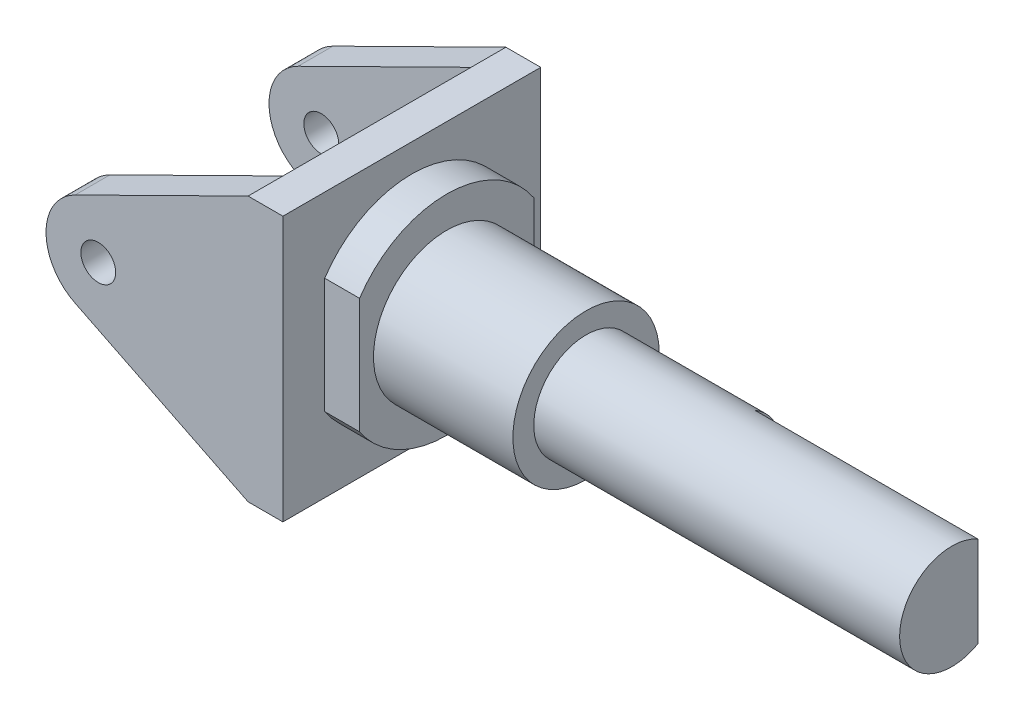
ISO-10303-21;
HEADER;
FILE_DESCRIPTION(('STEP AP214'),'2;1');
FILE_NAME('part.step','',(''),(''),'','','');
FILE_SCHEMA(('AUTOMOTIVE_DESIGN { 1 0 10303 214 1 1 1 1 }'));
ENDSEC;
DATA;
#1=APPLICATION_CONTEXT('core data for automotive mechanical design processes');
#2=APPLICATION_PROTOCOL_DEFINITION('international standard','automotive_design',2000,#1);
#3=PRODUCT_CONTEXT('',#1,'mechanical');
#4=PRODUCT('Part','Part','',(#3));
#5=PRODUCT_RELATED_PRODUCT_CATEGORY('part','',(#4));
#6=PRODUCT_DEFINITION_FORMATION('','',#4);
#7=PRODUCT_DEFINITION_CONTEXT('part definition',#1,'design');
#8=PRODUCT_DEFINITION('design','',#6,#7);
#9=PRODUCT_DEFINITION_SHAPE('','',#8);
#10=(LENGTH_UNIT() NAMED_UNIT(*) SI_UNIT(.MILLI.,.METRE.));
#11=(NAMED_UNIT(*) PLANE_ANGLE_UNIT() SI_UNIT($,.RADIAN.));
#12=(NAMED_UNIT(*) SI_UNIT($,.STERADIAN.) SOLID_ANGLE_UNIT());
#13=UNCERTAINTY_MEASURE_WITH_UNIT(LENGTH_MEASURE(1.E-05),#10,'distance_accuracy_value','');
#14=(GEOMETRIC_REPRESENTATION_CONTEXT(3) GLOBAL_UNCERTAINTY_ASSIGNED_CONTEXT((#13)) GLOBAL_UNIT_ASSIGNED_CONTEXT((#10,
#11,#12)) REPRESENTATION_CONTEXT('',''));
#15=CARTESIAN_POINT('',(0.,0.,0.));
#16=DIRECTION('',(0.,0.,1.));
#17=DIRECTION('',(1.,0.,0.));
#18=AXIS2_PLACEMENT_3D('',#15,#16,#17);
#19=CARTESIAN_POINT('',(77.5,0.,0.));
#20=DIRECTION('',(1.,0.,0.));
#21=DIRECTION('',(0.,0.,-1.));
#22=AXIS2_PLACEMENT_3D('',#19,#20,#21);
#23=CYLINDRICAL_SURFACE('',#22,30.);
#24=DIRECTION('',(1.,0.,0.));
#25=VECTOR('',#24,1.);
#26=CARTESIAN_POINT('',(-77.5,-16.583123951777,-25.));
#27=LINE('',#26,#25);
#28=CARTESIAN_POINT('',(-77.5,-16.583123951777,-25.));
#29=VERTEX_POINT('',#28);
#30=CARTESIAN_POINT('',(-67.5,-16.583123951777,-25.));
#31=VERTEX_POINT('',#30);
#32=EDGE_CURVE('E193',#29,#31,#27,.T.);
#33=ORIENTED_EDGE('',*,*,#32,.T.);
#34=CARTESIAN_POINT('',(-67.5,0.,0.));
#35=DIRECTION('',(1.,0.,0.));
#36=DIRECTION('',(0.,0.,-1.));
#37=AXIS2_PLACEMENT_3D('',#34,#35,#36);
#38=CIRCLE('',#37,30.);
#39=CARTESIAN_POINT('',(-67.5,-16.583123951777,25.));
#40=VERTEX_POINT('',#39);
#41=EDGE_CURVE('E55',#40,#31,#38,.T.);
#42=ORIENTED_EDGE('',*,*,#41,.F.);
#43=DIRECTION('',(1.,0.,0.));
#44=VECTOR('',#43,1.);
#45=CARTESIAN_POINT('',(-77.5,-16.583123951777,25.));
#46=LINE('',#45,#44);
#47=CARTESIAN_POINT('',(-77.5,-16.583123951777,25.));
#48=VERTEX_POINT('',#47);
#49=EDGE_CURVE('E200',#48,#40,#46,.T.);
#50=ORIENTED_EDGE('',*,*,#49,.F.);
#51=CARTESIAN_POINT('',(-77.5,0.,0.));
#52=DIRECTION('',(1.,0.,0.));
#53=DIRECTION('',(0.,0.,-1.));
#54=AXIS2_PLACEMENT_3D('',#51,#52,#53);
#55=CIRCLE('',#54,30.);
#56=EDGE_CURVE('E332',#48,#29,#55,.T.);
#57=ORIENTED_EDGE('',*,*,#56,.T.);
#58=EDGE_LOOP('',(#33,#42,#50,#57));
#59=FACE_BOUND('',#58,.T.);
#60=ADVANCED_FACE('F45',(#59),#23,.T.);
#61=CARTESIAN_POINT('',(-87.5,0.,0.));
#62=DIRECTION('',(-1.,0.,0.));
#63=DIRECTION('',(0.,0.,1.));
#64=AXIS2_PLACEMENT_3D('',#61,#62,#63);
#65=PLANE('',#64);
#66=DIRECTION('',(0.,0.,1.));
#67=VECTOR('',#66,1.);
#68=CARTESIAN_POINT('',(-87.5,-38.,-37.));
#69=LINE('',#68,#67);
#70=CARTESIAN_POINT('',(-87.5,-38.,-27.));
#71=VERTEX_POINT('',#70);
#72=CARTESIAN_POINT('',(-87.5,-38.,27.));
#73=VERTEX_POINT('',#72);
#74=EDGE_CURVE('E298',#71,#73,#69,.T.);
#75=ORIENTED_EDGE('',*,*,#74,.T.);
#76=DIRECTION('',(0.,1.,0.));
#77=VECTOR('',#76,1.);
#78=CARTESIAN_POINT('',(-87.5,0.,27.));
#79=LINE('',#78,#77);
#80=CARTESIAN_POINT('',(-87.5,38.,27.));
#81=VERTEX_POINT('',#80);
#82=EDGE_CURVE('E254',#73,#81,#79,.T.);
#83=ORIENTED_EDGE('',*,*,#82,.T.);
#84=DIRECTION('',(0.,0.,-1.));
#85=VECTOR('',#84,1.);
#86=CARTESIAN_POINT('',(-87.5,38.,-37.));
#87=LINE('',#86,#85);
#88=CARTESIAN_POINT('',(-87.5,38.,-27.));
#89=VERTEX_POINT('',#88);
#90=EDGE_CURVE('E299',#81,#89,#87,.T.);
#91=ORIENTED_EDGE('',*,*,#90,.T.);
#92=DIRECTION('',(0.,-1.,0.));
#93=VECTOR('',#92,1.);
#94=CARTESIAN_POINT('',(-87.5,0.,-27.));
#95=LINE('',#94,#93);
#96=EDGE_CURVE('E290',#89,#71,#95,.T.);
#97=ORIENTED_EDGE('',*,*,#96,.T.);
#98=EDGE_LOOP('',(#75,#83,#91,#97));
#99=FACE_BOUND('',#98,.T.);
#100=ADVANCED_FACE('F386',(#99),#65,.T.);
#101=DIRECTION('',(1.,0.,0.));
#102=VECTOR('',#101,1.);
#103=CARTESIAN_POINT('',(-77.5,16.583123951777,-25.));
#104=LINE('',#103,#102);
#105=CARTESIAN_POINT('',(-77.5,16.583123951777,-25.));
#106=VERTEX_POINT('',#105);
#107=CARTESIAN_POINT('',(-67.5,16.583123951777,-25.));
#108=VERTEX_POINT('',#107);
#109=EDGE_CURVE('E188',#106,#108,#104,.T.);
#110=ORIENTED_EDGE('',*,*,#109,.F.);
#111=CARTESIAN_POINT('',(-77.5,16.583123951777,25.));
#112=VERTEX_POINT('',#111);
#113=EDGE_CURVE('E333',#106,#112,#55,.T.);
#114=ORIENTED_EDGE('',*,*,#113,.T.);
#115=DIRECTION('',(1.,0.,0.));
#116=VECTOR('',#115,1.);
#117=CARTESIAN_POINT('',(-77.5,16.583123951777,25.));
#118=LINE('',#117,#116);
#119=CARTESIAN_POINT('',(-67.5,16.583123951777,25.));
#120=VERTEX_POINT('',#119);
#121=EDGE_CURVE('E182',#112,#120,#118,.T.);
#122=ORIENTED_EDGE('',*,*,#121,.T.);
#123=EDGE_CURVE('E11',#108,#120,#38,.T.);
#124=ORIENTED_EDGE('',*,*,#123,.F.);
#125=EDGE_LOOP('',(#110,#114,#122,#124));
#126=FACE_BOUND('',#125,.T.);
#127=ADVANCED_FACE('F47',(#126),#23,.T.);
#128=CARTESIAN_POINT('',(-67.5,30.,0.));
#129=DIRECTION('',(1.,0.,0.));
#130=DIRECTION('',(0.,0.,-1.));
#131=AXIS2_PLACEMENT_3D('',#128,#129,#130);
#132=PLANE('',#131);
#133=DIRECTION('',(0.,-1.,0.));
#134=VECTOR('',#133,1.);
#135=CARTESIAN_POINT('',(-67.5,16.583123951777,-25.));
#136=LINE('',#135,#134);
#137=EDGE_CURVE('E189',#108,#31,#136,.T.);
#138=ORIENTED_EDGE('',*,*,#137,.F.);
#139=ORIENTED_EDGE('',*,*,#123,.T.);
#140=DIRECTION('',(0.,1.,0.));
#141=VECTOR('',#140,1.);
#142=CARTESIAN_POINT('',(-67.5,16.583123951777,25.));
#143=LINE('',#142,#141);
#144=EDGE_CURVE('E192',#40,#120,#143,.T.);
#145=ORIENTED_EDGE('',*,*,#144,.F.);
#146=ORIENTED_EDGE('',*,*,#41,.T.);
#147=EDGE_LOOP('',(#138,#139,#145,#146));
#148=FACE_BOUND('',#147,.T.);
#149=CARTESIAN_POINT('',(-67.5,0.,0.));
#150=DIRECTION('',(1.,0.,0.));
#151=DIRECTION('',(0.,0.,-1.));
#152=AXIS2_PLACEMENT_3D('',#149,#150,#151);
#153=CIRCLE('',#152,21.);
#154=CARTESIAN_POINT('',(-67.5,0.,-21.));
#155=VERTEX_POINT('',#154);
#156=EDGE_CURVE('E347',#155,#155,#153,.T.);
#157=ORIENTED_EDGE('',*,*,#156,.F.);
#158=EDGE_LOOP('',(#157));
#159=FACE_BOUND('',#158,.T.);
#160=ADVANCED_FACE('F358',(#148,#159),#132,.T.);
#161=CARTESIAN_POINT('',(77.5,0.,0.));
#162=DIRECTION('',(1.,0.,0.));
#163=DIRECTION('',(0.,0.,-1.));
#164=AXIS2_PLACEMENT_3D('',#161,#162,#163);
#165=CYLINDRICAL_SURFACE('',#164,21.);
#166=ORIENTED_EDGE('',*,*,#156,.T.);
#167=EDGE_LOOP('',(#166));
#168=FACE_BOUND('',#167,.T.);
#169=CARTESIAN_POINT('',(-27.5,0.,0.));
#170=DIRECTION('',(1.,0.,0.));
#171=DIRECTION('',(0.,0.,-1.));
#172=AXIS2_PLACEMENT_3D('',#169,#170,#171);
#173=CIRCLE('',#172,21.);
#174=CARTESIAN_POINT('',(-27.5,0.,-21.));
#175=VERTEX_POINT('',#174);
#176=EDGE_CURVE('E343',#175,#175,#173,.T.);
#177=ORIENTED_EDGE('',*,*,#176,.F.);
#178=EDGE_LOOP('',(#177));
#179=FACE_BOUND('',#178,.T.);
#180=ADVANCED_FACE('F396',(#168,#179),#165,.T.);
#181=CARTESIAN_POINT('',(-27.5,21.,0.));
#182=DIRECTION('',(1.,0.,0.));
#183=DIRECTION('',(0.,0.,-1.));
#184=AXIS2_PLACEMENT_3D('',#181,#182,#183);
#185=PLANE('',#184);
#186=ORIENTED_EDGE('',*,*,#176,.T.);
#187=EDGE_LOOP('',(#186));
#188=FACE_BOUND('',#187,.T.);
#189=CARTESIAN_POINT('',(-27.5,0.,0.));
#190=DIRECTION('',(1.,0.,0.));
#191=DIRECTION('',(0.,0.,-1.));
#192=AXIS2_PLACEMENT_3D('',#189,#190,#191);
#193=CIRCLE('',#192,15.);
#194=CARTESIAN_POINT('',(-27.5,0.,-15.));
#195=VERTEX_POINT('',#194);
#196=EDGE_CURVE('E339',#195,#195,#193,.T.);
#197=ORIENTED_EDGE('',*,*,#196,.F.);
#198=EDGE_LOOP('',(#197));
#199=FACE_BOUND('',#198,.T.);
#200=ADVANCED_FACE('F400',(#188,#199),#185,.T.);
#201=CARTESIAN_POINT('',(77.5,0.,0.));
#202=DIRECTION('',(1.,0.,0.));
#203=DIRECTION('',(0.,0.,-1.));
#204=AXIS2_PLACEMENT_3D('',#201,#202,#203);
#205=CYLINDRICAL_SURFACE('',#204,15.);
#206=DIRECTION('',(1.,0.,0.));
#207=VECTOR('',#206,1.);
#208=CARTESIAN_POINT('',(13.5,-12.9903810567666,-7.5));
#209=LINE('',#208,#207);
#210=CARTESIAN_POINT('',(13.5,-12.9903810567666,-7.5));
#211=VERTEX_POINT('',#210);
#212=CARTESIAN_POINT('',(77.5,-12.9903810567666,-7.5));
#213=VERTEX_POINT('',#212);
#214=EDGE_CURVE('E171',#211,#213,#209,.T.);
#215=ORIENTED_EDGE('',*,*,#214,.T.);
#216=CARTESIAN_POINT('',(77.5,0.,0.));
#217=DIRECTION('',(1.,0.,0.));
#218=DIRECTION('',(0.,0.,-1.));
#219=AXIS2_PLACEMENT_3D('',#216,#217,#218);
#220=CIRCLE('',#219,15.);
#221=CARTESIAN_POINT('',(77.5,12.9903810567666,-7.5));
#222=VERTEX_POINT('',#221);
#223=EDGE_CURVE('E178',#222,#213,#220,.T.);
#224=ORIENTED_EDGE('',*,*,#223,.F.);
#225=DIRECTION('',(1.,0.,0.));
#226=VECTOR('',#225,1.);
#227=CARTESIAN_POINT('',(13.5,12.9903810567666,-7.5));
#228=LINE('',#227,#226);
#229=CARTESIAN_POINT('',(13.5,12.9903810567666,-7.5));
#230=VERTEX_POINT('',#229);
#231=EDGE_CURVE('E62',#230,#222,#228,.T.);
#232=ORIENTED_EDGE('',*,*,#231,.F.);
#233=CARTESIAN_POINT('',(13.5,0.,0.));
#234=DIRECTION('',(1.,0.,0.));
#235=DIRECTION('',(0.,0.,-1.));
#236=AXIS2_PLACEMENT_3D('',#233,#234,#235);
#237=CIRCLE('',#236,15.);
#238=EDGE_CURVE('E162',#211,#230,#237,.T.);
#239=ORIENTED_EDGE('',*,*,#238,.F.);
#240=EDGE_LOOP('',(#215,#224,#232,#239));
#241=FACE_BOUND('',#240,.T.);
#242=ORIENTED_EDGE('',*,*,#196,.T.);
#243=EDGE_LOOP('',(#242));
#244=FACE_BOUND('',#243,.T.);
#245=ADVANCED_FACE('F175',(#241,#244),#205,.T.);
#246=CARTESIAN_POINT('',(77.5,15.,0.));
#247=DIRECTION('',(1.,0.,0.));
#248=DIRECTION('',(0.,0.,-1.));
#249=AXIS2_PLACEMENT_3D('',#246,#247,#248);
#250=PLANE('',#249);
#251=DIRECTION('',(0.,-1.,0.));
#252=VECTOR('',#251,1.);
#253=CARTESIAN_POINT('',(77.5,12.9903810567666,-7.5));
#254=LINE('',#253,#252);
#255=EDGE_CURVE('E168',#222,#213,#254,.T.);
#256=ORIENTED_EDGE('',*,*,#255,.F.);
#257=ORIENTED_EDGE('',*,*,#223,.T.);
#258=EDGE_LOOP('',(#256,#257));
#259=FACE_BOUND('',#258,.T.);
#260=ADVANCED_FACE('F408',(#259),#250,.T.);
#261=CARTESIAN_POINT('',(-87.5,38.,37.));
#262=DIRECTION('',(0.,0.,-1.));
#263=DIRECTION('',(0.,1.,0.));
#264=AXIS2_PLACEMENT_3D('',#261,#262,#263);
#265=PLANE('',#264);
#266=CARTESIAN_POINT('',(-130.5,0.,37.));
#267=DIRECTION('',(0.,0.,-1.));
#268=DIRECTION('',(0.,1.,0.));
#269=AXIS2_PLACEMENT_3D('',#266,#267,#268);
#270=CIRCLE('',#269,5.);
#271=CARTESIAN_POINT('',(-130.5,5.00000000000002,37.));
#272=VERTEX_POINT('',#271);
#273=EDGE_CURVE('E214',#272,#272,#270,.T.);
#274=ORIENTED_EDGE('',*,*,#273,.T.);
#275=EDGE_LOOP('',(#274));
#276=FACE_BOUND('',#275,.T.);
#277=DIRECTION('',(0.,1.,0.));
#278=VECTOR('',#277,1.);
#279=CARTESIAN_POINT('',(-77.5,38.,37.));
#280=LINE('',#279,#278);
#281=CARTESIAN_POINT('',(-77.5,-38.,37.));
#282=VERTEX_POINT('',#281);
#283=CARTESIAN_POINT('',(-77.5,38.,37.));
#284=VERTEX_POINT('',#283);
#285=EDGE_CURVE('E293',#282,#284,#280,.T.);
#286=ORIENTED_EDGE('',*,*,#285,.T.);
#287=DIRECTION('',(1.,0.,0.));
#288=VECTOR('',#287,1.);
#289=CARTESIAN_POINT('',(-87.5,38.,37.));
#290=LINE('',#289,#288);
#291=CARTESIAN_POINT('',(-87.5,38.,37.));
#292=VERTEX_POINT('',#291);
#293=EDGE_CURVE('E328',#292,#284,#290,.T.);
#294=ORIENTED_EDGE('',*,*,#293,.F.);
#295=DIRECTION('',(-0.896371022456639,-0.443304624496564,0.));
#296=VECTOR('',#295,1.);
#297=CARTESIAN_POINT('',(-87.5,38.,37.));
#298=LINE('',#297,#296);
#299=CARTESIAN_POINT('',(-137.149569367448,13.4455653368496,37.));
#300=VERTEX_POINT('',#299);
#301=EDGE_CURVE('E227',#292,#300,#298,.T.);
#302=ORIENTED_EDGE('',*,*,#301,.T.);
#303=CARTESIAN_POINT('',(-130.5,0.,37.));
#304=DIRECTION('',(0.,0.,-1.));
#305=DIRECTION('',(0.,1.,0.));
#306=AXIS2_PLACEMENT_3D('',#303,#304,#305);
#307=CIRCLE('',#306,15.);
#308=CARTESIAN_POINT('',(-137.149569367448,-13.4455653368496,37.));
#309=VERTEX_POINT('',#308);
#310=EDGE_CURVE('E237',#309,#300,#307,.T.);
#311=ORIENTED_EDGE('',*,*,#310,.F.);
#312=DIRECTION('',(-0.896371022456639,0.443304624496565,0.));
#313=VECTOR('',#312,1.);
#314=CARTESIAN_POINT('',(-87.5,-38.,37.));
#315=LINE('',#314,#313);
#316=CARTESIAN_POINT('',(-87.5,-38.,37.));
#317=VERTEX_POINT('',#316);
#318=EDGE_CURVE('E222',#317,#309,#315,.T.);
#319=ORIENTED_EDGE('',*,*,#318,.F.);
#320=DIRECTION('',(1.,0.,0.));
#321=VECTOR('',#320,1.);
#322=CARTESIAN_POINT('',(-87.5,-38.,37.));
#323=LINE('',#322,#321);
#324=EDGE_CURVE('E304',#317,#282,#323,.T.);
#325=ORIENTED_EDGE('',*,*,#324,.T.);
#326=EDGE_LOOP('',(#286,#294,#302,#311,#319,#325));
#327=FACE_BOUND('',#326,.T.);
#328=ADVANCED_FACE('F411',(#276,#327),#265,.F.);
#329=CARTESIAN_POINT('',(-87.5,38.,-37.));
#330=DIRECTION('',(0.,-1.,0.));
#331=DIRECTION('',(0.,0.,-1.));
#332=AXIS2_PLACEMENT_3D('',#329,#330,#331);
#333=PLANE('',#332);
#334=DIRECTION('',(0.,0.,-1.));
#335=VECTOR('',#334,1.);
#336=CARTESIAN_POINT('',(-77.5,38.,-37.));
#337=LINE('',#336,#335);
#338=CARTESIAN_POINT('',(-77.5,38.,-37.));
#339=VERTEX_POINT('',#338);
#340=EDGE_CURVE('E308',#284,#339,#337,.T.);
#341=ORIENTED_EDGE('',*,*,#340,.T.);
#342=DIRECTION('',(1.,0.,0.));
#343=VECTOR('',#342,1.);
#344=CARTESIAN_POINT('',(-87.5,38.,-37.));
#345=LINE('',#344,#343);
#346=CARTESIAN_POINT('',(-87.5,38.,-37.));
#347=VERTEX_POINT('',#346);
#348=EDGE_CURVE('E324',#347,#339,#345,.T.);
#349=ORIENTED_EDGE('',*,*,#348,.F.);
#350=DIRECTION('',(0.,0.,-1.));
#351=VECTOR('',#350,1.);
#352=CARTESIAN_POINT('',(-87.5,38.,-27.));
#353=LINE('',#352,#351);
#354=EDGE_CURVE('E286',#89,#347,#353,.T.);
#355=ORIENTED_EDGE('',*,*,#354,.F.);
#356=ORIENTED_EDGE('',*,*,#90,.F.);
#357=EDGE_CURVE('E294',#292,#81,#87,.T.);
#358=ORIENTED_EDGE('',*,*,#357,.F.);
#359=ORIENTED_EDGE('',*,*,#293,.T.);
#360=EDGE_LOOP('',(#341,#349,#355,#356,#358,#359));
#361=FACE_BOUND('',#360,.T.);
#362=ADVANCED_FACE('F415',(#361),#333,.F.);
#363=CARTESIAN_POINT('',(-87.5,38.,-37.));
#364=DIRECTION('',(0.,0.,1.));
#365=DIRECTION('',(0.,-1.,0.));
#366=AXIS2_PLACEMENT_3D('',#363,#364,#365);
#367=PLANE('',#366);
#368=CARTESIAN_POINT('',(-130.5,0.,-37.));
#369=DIRECTION('',(0.,0.,-1.));
#370=DIRECTION('',(0.,1.,0.));
#371=AXIS2_PLACEMENT_3D('',#368,#369,#370);
#372=CIRCLE('',#371,5.);
#373=CARTESIAN_POINT('',(-130.5,4.99999999999999,-37.));
#374=VERTEX_POINT('',#373);
#375=EDGE_CURVE('E197',#374,#374,#372,.T.);
#376=ORIENTED_EDGE('',*,*,#375,.F.);
#377=EDGE_LOOP('',(#376));
#378=FACE_BOUND('',#377,.T.);
#379=DIRECTION('',(0.,-1.,0.));
#380=VECTOR('',#379,1.);
#381=CARTESIAN_POINT('',(-77.5,38.,-37.));
#382=LINE('',#381,#380);
#383=CARTESIAN_POINT('',(-77.5,-38.,-37.));
#384=VERTEX_POINT('',#383);
#385=EDGE_CURVE('E311',#339,#384,#382,.T.);
#386=ORIENTED_EDGE('',*,*,#385,.T.);
#387=DIRECTION('',(1.,0.,0.));
#388=VECTOR('',#387,1.);
#389=CARTESIAN_POINT('',(-87.5,-38.,-37.));
#390=LINE('',#389,#388);
#391=CARTESIAN_POINT('',(-87.5,-38.,-37.));
#392=VERTEX_POINT('',#391);
#393=EDGE_CURVE('E320',#392,#384,#390,.T.);
#394=ORIENTED_EDGE('',*,*,#393,.F.);
#395=DIRECTION('',(-0.896371022456639,0.443304624496565,0.));
#396=VECTOR('',#395,1.);
#397=CARTESIAN_POINT('',(-87.5,-38.,-37.));
#398=LINE('',#397,#396);
#399=CARTESIAN_POINT('',(-137.149569367448,-13.4455653368496,-37.));
#400=VERTEX_POINT('',#399);
#401=EDGE_CURVE('E262',#392,#400,#398,.T.);
#402=ORIENTED_EDGE('',*,*,#401,.T.);
#403=CARTESIAN_POINT('',(-130.5,0.,-37.));
#404=DIRECTION('',(0.,0.,-1.));
#405=DIRECTION('',(0.,1.,0.));
#406=AXIS2_PLACEMENT_3D('',#403,#404,#405);
#407=CIRCLE('',#406,15.);
#408=CARTESIAN_POINT('',(-137.149569367448,13.4455653368496,-37.));
#409=VERTEX_POINT('',#408);
#410=EDGE_CURVE('E274',#400,#409,#407,.T.);
#411=ORIENTED_EDGE('',*,*,#410,.T.);
#412=DIRECTION('',(-0.896371022456639,-0.443304624496564,0.));
#413=VECTOR('',#412,1.);
#414=CARTESIAN_POINT('',(-87.5,38.,-37.));
#415=LINE('',#414,#413);
#416=EDGE_CURVE('E257',#347,#409,#415,.T.);
#417=ORIENTED_EDGE('',*,*,#416,.F.);
#418=ORIENTED_EDGE('',*,*,#348,.T.);
#419=EDGE_LOOP('',(#386,#394,#402,#411,#417,#418));
#420=FACE_BOUND('',#419,.T.);
#421=ADVANCED_FACE('F419',(#378,#420),#367,.F.);
#422=CARTESIAN_POINT('',(-87.5,-38.,-37.));
#423=DIRECTION('',(0.,1.,0.));
#424=DIRECTION('',(0.,0.,1.));
#425=AXIS2_PLACEMENT_3D('',#422,#423,#424);
#426=PLANE('',#425);
#427=DIRECTION('',(0.,0.,1.));
#428=VECTOR('',#427,1.);
#429=CARTESIAN_POINT('',(-87.5,-38.,27.));
#430=LINE('',#429,#428);
#431=EDGE_CURVE('E250',#73,#317,#430,.T.);
#432=ORIENTED_EDGE('',*,*,#431,.F.);
#433=ORIENTED_EDGE('',*,*,#74,.F.);
#434=EDGE_CURVE('E300',#392,#71,#69,.T.);
#435=ORIENTED_EDGE('',*,*,#434,.F.);
#436=ORIENTED_EDGE('',*,*,#393,.T.);
#437=DIRECTION('',(0.,0.,1.));
#438=VECTOR('',#437,1.);
#439=CARTESIAN_POINT('',(-77.5,-38.,-37.));
#440=LINE('',#439,#438);
#441=EDGE_CURVE('E314',#384,#282,#440,.T.);
#442=ORIENTED_EDGE('',*,*,#441,.T.);
#443=ORIENTED_EDGE('',*,*,#324,.F.);
#444=EDGE_LOOP('',(#432,#433,#435,#436,#442,#443));
#445=FACE_BOUND('',#444,.T.);
#446=ADVANCED_FACE('F423',(#445),#426,.F.);
#447=CARTESIAN_POINT('',(-77.5,0.,0.));
#448=DIRECTION('',(-1.,0.,0.));
#449=DIRECTION('',(0.,0.,1.));
#450=AXIS2_PLACEMENT_3D('',#447,#448,#449);
#451=PLANE('',#450);
#452=ORIENTED_EDGE('',*,*,#113,.F.);
#453=DIRECTION('',(0.,-1.,0.));
#454=VECTOR('',#453,1.);
#455=CARTESIAN_POINT('',(-77.5,16.583123951777,-25.));
#456=LINE('',#455,#454);
#457=EDGE_CURVE('E70',#106,#29,#456,.T.);
#458=ORIENTED_EDGE('',*,*,#457,.T.);
#459=ORIENTED_EDGE('',*,*,#56,.F.);
#460=DIRECTION('',(0.,1.,0.));
#461=VECTOR('',#460,1.);
#462=CARTESIAN_POINT('',(-77.5,16.583123951777,25.));
#463=LINE('',#462,#461);
#464=EDGE_CURVE('E203',#48,#112,#463,.T.);
#465=ORIENTED_EDGE('',*,*,#464,.T.);
#466=EDGE_LOOP('',(#452,#458,#459,#465));
#467=FACE_BOUND('',#466,.T.);
#468=ORIENTED_EDGE('',*,*,#285,.F.);
#469=ORIENTED_EDGE('',*,*,#441,.F.);
#470=ORIENTED_EDGE('',*,*,#385,.F.);
#471=ORIENTED_EDGE('',*,*,#340,.F.);
#472=EDGE_LOOP('',(#468,#469,#470,#471));
#473=FACE_BOUND('',#472,.T.);
#474=ADVANCED_FACE('F368',(#467,#473),#451,.F.);
#475=CARTESIAN_POINT('',(-87.5,38.,-27.));
#476=DIRECTION('',(0.443304624496564,-0.896371022456639,0.));
#477=DIRECTION('',(0.896371022456639,0.443304624496564,0.));
#478=AXIS2_PLACEMENT_3D('',#475,#476,#477);
#479=PLANE('',#478);
#480=ORIENTED_EDGE('',*,*,#416,.T.);
#481=DIRECTION('',(0.,0.,-1.));
#482=VECTOR('',#481,1.);
#483=CARTESIAN_POINT('',(-137.149569367448,13.4455653368496,-27.));
#484=LINE('',#483,#482);
#485=CARTESIAN_POINT('',(-137.149569367448,13.4455653368496,-27.));
#486=VERTEX_POINT('',#485);
#487=EDGE_CURVE('E283',#486,#409,#484,.T.);
#488=ORIENTED_EDGE('',*,*,#487,.F.);
#489=DIRECTION('',(-0.896371022456639,-0.443304624496564,0.));
#490=VECTOR('',#489,1.);
#491=CARTESIAN_POINT('',(-87.5,38.,-27.));
#492=LINE('',#491,#490);
#493=EDGE_CURVE('E258',#89,#486,#492,.T.);
#494=ORIENTED_EDGE('',*,*,#493,.F.);
#495=ORIENTED_EDGE('',*,*,#354,.T.);
#496=EDGE_LOOP('',(#480,#488,#494,#495));
#497=FACE_BOUND('',#496,.T.);
#498=ADVANCED_FACE('F428',(#497),#479,.F.);
#499=CARTESIAN_POINT('',(-130.5,0.,-27.));
#500=DIRECTION('',(0.,0.,-1.));
#501=DIRECTION('',(0.,1.,0.));
#502=AXIS2_PLACEMENT_3D('',#499,#500,#501);
#503=CYLINDRICAL_SURFACE('',#502,15.);
#504=ORIENTED_EDGE('',*,*,#410,.F.);
#505=DIRECTION('',(0.,0.,-1.));
#506=VECTOR('',#505,1.);
#507=CARTESIAN_POINT('',(-137.149569367448,-13.4455653368496,-27.));
#508=LINE('',#507,#506);
#509=CARTESIAN_POINT('',(-137.149569367448,-13.4455653368496,-27.));
#510=VERTEX_POINT('',#509);
#511=EDGE_CURVE('E270',#510,#400,#508,.T.);
#512=ORIENTED_EDGE('',*,*,#511,.F.);
#513=CARTESIAN_POINT('',(-130.5,0.,-27.));
#514=DIRECTION('',(0.,0.,-1.));
#515=DIRECTION('',(0.,1.,0.));
#516=AXIS2_PLACEMENT_3D('',#513,#514,#515);
#517=CIRCLE('',#516,15.);
#518=EDGE_CURVE('E261',#510,#486,#517,.T.);
#519=ORIENTED_EDGE('',*,*,#518,.T.);
#520=ORIENTED_EDGE('',*,*,#487,.T.);
#521=EDGE_LOOP('',(#504,#512,#519,#520));
#522=FACE_BOUND('',#521,.T.);
#523=ADVANCED_FACE('F432',(#522),#503,.T.);
#524=CARTESIAN_POINT('',(-87.5,-38.,-27.));
#525=DIRECTION('',(-0.443304624496565,-0.896371022456639,0.));
#526=DIRECTION('',(0.896371022456639,-0.443304624496565,0.));
#527=AXIS2_PLACEMENT_3D('',#524,#525,#526);
#528=PLANE('',#527);
#529=ORIENTED_EDGE('',*,*,#401,.F.);
#530=ORIENTED_EDGE('',*,*,#434,.T.);
#531=DIRECTION('',(-0.896371022456639,0.443304624496565,0.));
#532=VECTOR('',#531,1.);
#533=CARTESIAN_POINT('',(-87.5,-38.,-27.));
#534=LINE('',#533,#532);
#535=EDGE_CURVE('E266',#71,#510,#534,.T.);
#536=ORIENTED_EDGE('',*,*,#535,.T.);
#537=ORIENTED_EDGE('',*,*,#511,.T.);
#538=EDGE_LOOP('',(#529,#530,#536,#537));
#539=FACE_BOUND('',#538,.T.);
#540=ADVANCED_FACE('F436',(#539),#528,.T.);
#541=CARTESIAN_POINT('',(-130.5,0.,-27.));
#542=DIRECTION('',(0.,0.,-1.));
#543=DIRECTION('',(0.,1.,0.));
#544=AXIS2_PLACEMENT_3D('',#541,#542,#543);
#545=PLANE('',#544);
#546=CARTESIAN_POINT('',(-130.5,0.,-27.));
#547=DIRECTION('',(0.,0.,-1.));
#548=DIRECTION('',(0.,1.,0.));
#549=AXIS2_PLACEMENT_3D('',#546,#547,#548);
#550=CIRCLE('',#549,5.);
#551=CARTESIAN_POINT('',(-130.5,5.,-27.));
#552=VERTEX_POINT('',#551);
#553=EDGE_CURVE('E218',#552,#552,#550,.T.);
#554=ORIENTED_EDGE('',*,*,#553,.T.);
#555=EDGE_LOOP('',(#554));
#556=FACE_BOUND('',#555,.T.);
#557=ORIENTED_EDGE('',*,*,#96,.F.);
#558=ORIENTED_EDGE('',*,*,#493,.T.);
#559=ORIENTED_EDGE('',*,*,#518,.F.);
#560=ORIENTED_EDGE('',*,*,#535,.F.);
#561=EDGE_LOOP('',(#557,#558,#559,#560));
#562=FACE_BOUND('',#561,.T.);
#563=ADVANCED_FACE('F440',(#556,#562),#545,.F.);
#564=CARTESIAN_POINT('',(-87.5,-38.,27.));
#565=DIRECTION('',(0.443304624496565,0.896371022456639,0.));
#566=DIRECTION('',(-0.896371022456639,0.443304624496565,0.));
#567=AXIS2_PLACEMENT_3D('',#564,#565,#566);
#568=PLANE('',#567);
#569=ORIENTED_EDGE('',*,*,#318,.T.);
#570=DIRECTION('',(0.,0.,1.));
#571=VECTOR('',#570,1.);
#572=CARTESIAN_POINT('',(-137.149569367448,-13.4455653368496,27.));
#573=LINE('',#572,#571);
#574=CARTESIAN_POINT('',(-137.149569367448,-13.4455653368496,27.));
#575=VERTEX_POINT('',#574);
#576=EDGE_CURVE('E246',#575,#309,#573,.T.);
#577=ORIENTED_EDGE('',*,*,#576,.F.);
#578=DIRECTION('',(-0.896371022456639,0.443304624496565,0.));
#579=VECTOR('',#578,1.);
#580=CARTESIAN_POINT('',(-87.5,-38.,27.));
#581=LINE('',#580,#579);
#582=EDGE_CURVE('E223',#73,#575,#581,.T.);
#583=ORIENTED_EDGE('',*,*,#582,.F.);
#584=ORIENTED_EDGE('',*,*,#431,.T.);
#585=EDGE_LOOP('',(#569,#577,#583,#584));
#586=FACE_BOUND('',#585,.T.);
#587=ADVANCED_FACE('F444',(#586),#568,.F.);
#588=CARTESIAN_POINT('',(-130.5,0.,27.));
#589=DIRECTION('',(0.,0.,1.));
#590=DIRECTION('',(0.,-1.,0.));
#591=AXIS2_PLACEMENT_3D('',#588,#589,#590);
#592=CYLINDRICAL_SURFACE('',#591,15.);
#593=ORIENTED_EDGE('',*,*,#310,.T.);
#594=DIRECTION('',(0.,0.,1.));
#595=VECTOR('',#594,1.);
#596=CARTESIAN_POINT('',(-137.149569367448,13.4455653368496,27.));
#597=LINE('',#596,#595);
#598=CARTESIAN_POINT('',(-137.149569367448,13.4455653368496,27.));
#599=VERTEX_POINT('',#598);
#600=EDGE_CURVE('E234',#599,#300,#597,.T.);
#601=ORIENTED_EDGE('',*,*,#600,.F.);
#602=CARTESIAN_POINT('',(-130.5,0.,27.));
#603=DIRECTION('',(0.,0.,-1.));
#604=DIRECTION('',(0.,1.,0.));
#605=AXIS2_PLACEMENT_3D('',#602,#603,#604);
#606=CIRCLE('',#605,15.);
#607=EDGE_CURVE('E226',#575,#599,#606,.T.);
#608=ORIENTED_EDGE('',*,*,#607,.F.);
#609=ORIENTED_EDGE('',*,*,#576,.T.);
#610=EDGE_LOOP('',(#593,#601,#608,#609));
#611=FACE_BOUND('',#610,.T.);
#612=ADVANCED_FACE('F448',(#611),#592,.T.);
#613=CARTESIAN_POINT('',(-87.5,38.,27.));
#614=DIRECTION('',(-0.443304624496564,0.896371022456639,0.));
#615=DIRECTION('',(-0.896371022456639,-0.443304624496564,0.));
#616=AXIS2_PLACEMENT_3D('',#613,#614,#615);
#617=PLANE('',#616);
#618=ORIENTED_EDGE('',*,*,#301,.F.);
#619=ORIENTED_EDGE('',*,*,#357,.T.);
#620=DIRECTION('',(-0.896371022456639,-0.443304624496564,0.));
#621=VECTOR('',#620,1.);
#622=CARTESIAN_POINT('',(-87.5,38.,27.));
#623=LINE('',#622,#621);
#624=EDGE_CURVE('E230',#81,#599,#623,.T.);
#625=ORIENTED_EDGE('',*,*,#624,.T.);
#626=ORIENTED_EDGE('',*,*,#600,.T.);
#627=EDGE_LOOP('',(#618,#619,#625,#626));
#628=FACE_BOUND('',#627,.T.);
#629=ADVANCED_FACE('F452',(#628),#617,.T.);
#630=CARTESIAN_POINT('',(-130.5,0.,27.));
#631=DIRECTION('',(0.,0.,1.));
#632=DIRECTION('',(0.,1.,0.));
#633=AXIS2_PLACEMENT_3D('',#630,#631,#632);
#634=PLANE('',#633);
#635=CARTESIAN_POINT('',(-130.5,0.,27.));
#636=DIRECTION('',(0.,0.,1.));
#637=DIRECTION('',(0.,-1.,0.));
#638=AXIS2_PLACEMENT_3D('',#635,#636,#637);
#639=CIRCLE('',#638,5.);
#640=CARTESIAN_POINT('',(-130.5,-5.,27.));
#641=VERTEX_POINT('',#640);
#642=EDGE_CURVE('E49',#641,#641,#639,.T.);
#643=ORIENTED_EDGE('',*,*,#642,.T.);
#644=EDGE_LOOP('',(#643));
#645=FACE_BOUND('',#644,.T.);
#646=ORIENTED_EDGE('',*,*,#82,.F.);
#647=ORIENTED_EDGE('',*,*,#582,.T.);
#648=ORIENTED_EDGE('',*,*,#607,.T.);
#649=ORIENTED_EDGE('',*,*,#624,.F.);
#650=EDGE_LOOP('',(#646,#647,#648,#649));
#651=FACE_BOUND('',#650,.T.);
#652=ADVANCED_FACE('F456',(#645,#651),#634,.F.);
#653=CARTESIAN_POINT('',(-130.5,0.,-37.));
#654=DIRECTION('',(0.,0.,-1.));
#655=DIRECTION('',(0.,1.,0.));
#656=AXIS2_PLACEMENT_3D('',#653,#654,#655);
#657=CYLINDRICAL_SURFACE('',#656,5.);
#658=ORIENTED_EDGE('',*,*,#273,.F.);
#659=EDGE_LOOP('',(#658));
#660=FACE_BOUND('',#659,.T.);
#661=ORIENTED_EDGE('',*,*,#642,.F.);
#662=EDGE_LOOP('',(#661));
#663=FACE_BOUND('',#662,.T.);
#664=ADVANCED_FACE('F382',(#660,#663),#657,.F.);
#665=ORIENTED_EDGE('',*,*,#375,.T.);
#666=EDGE_LOOP('',(#665));
#667=FACE_BOUND('',#666,.T.);
#668=ORIENTED_EDGE('',*,*,#553,.F.);
#669=EDGE_LOOP('',(#668));
#670=FACE_BOUND('',#669,.T.);
#671=ADVANCED_FACE('F374',(#667,#670),#657,.F.);
#672=CARTESIAN_POINT('',(-77.5,16.583123951777,25.));
#673=DIRECTION('',(0.,0.,-1.));
#674=DIRECTION('',(0.,1.,0.));
#675=AXIS2_PLACEMENT_3D('',#672,#673,#674);
#676=PLANE('',#675);
#677=ORIENTED_EDGE('',*,*,#144,.T.);
#678=ORIENTED_EDGE('',*,*,#121,.F.);
#679=ORIENTED_EDGE('',*,*,#464,.F.);
#680=ORIENTED_EDGE('',*,*,#49,.T.);
#681=EDGE_LOOP('',(#677,#678,#679,#680));
#682=FACE_BOUND('',#681,.T.);
#683=ADVANCED_FACE('F372',(#682),#676,.F.);
#684=CARTESIAN_POINT('',(-77.5,16.583123951777,-25.));
#685=DIRECTION('',(0.,0.,1.));
#686=DIRECTION('',(0.,-1.,0.));
#687=AXIS2_PLACEMENT_3D('',#684,#685,#686);
#688=PLANE('',#687);
#689=ORIENTED_EDGE('',*,*,#137,.T.);
#690=ORIENTED_EDGE('',*,*,#32,.F.);
#691=ORIENTED_EDGE('',*,*,#457,.F.);
#692=ORIENTED_EDGE('',*,*,#109,.T.);
#693=EDGE_LOOP('',(#689,#690,#691,#692));
#694=FACE_BOUND('',#693,.T.);
#695=ADVANCED_FACE('F365',(#694),#688,.F.);
#696=CARTESIAN_POINT('',(13.5,12.9903810567666,-7.5));
#697=DIRECTION('',(0.,0.,1.));
#698=DIRECTION('',(0.,-1.,0.));
#699=AXIS2_PLACEMENT_3D('',#696,#697,#698);
#700=PLANE('',#699);
#701=ORIENTED_EDGE('',*,*,#255,.T.);
#702=ORIENTED_EDGE('',*,*,#214,.F.);
#703=DIRECTION('',(0.,-1.,0.));
#704=VECTOR('',#703,1.);
#705=CARTESIAN_POINT('',(13.5,12.9903810567666,-7.5));
#706=LINE('',#705,#704);
#707=EDGE_CURVE('E164',#230,#211,#706,.T.);
#708=ORIENTED_EDGE('',*,*,#707,.F.);
#709=ORIENTED_EDGE('',*,*,#231,.T.);
#710=EDGE_LOOP('',(#701,#702,#708,#709));
#711=FACE_BOUND('',#710,.T.);
#712=ADVANCED_FACE('F170',(#711),#700,.F.);
#713=CARTESIAN_POINT('',(13.5,0.,0.));
#714=DIRECTION('',(1.,0.,0.));
#715=DIRECTION('',(0.,0.,-1.));
#716=AXIS2_PLACEMENT_3D('',#713,#714,#715);
#717=PLANE('',#716);
#718=ORIENTED_EDGE('',*,*,#238,.T.);
#719=ORIENTED_EDGE('',*,*,#707,.T.);
#720=EDGE_LOOP('',(#718,#719));
#721=FACE_BOUND('',#720,.T.);
#722=ADVANCED_FACE('F163',(#721),#717,.T.);
#723=CLOSED_SHELL('',(#60,#100,#127,#160,#180,#200,#245,#260,#328,#362,#421,#446,#474,#498,#523,
#540,#563,#587,#612,#629,#652,#664,#671,#683,#695,#712,#722));
#724=MANIFOLD_SOLID_BREP('B2',#723);
#725=ADVANCED_BREP_SHAPE_REPRESENTATION('',(#18,#724),#14);
#726=SHAPE_DEFINITION_REPRESENTATION(#9,#725);
ENDSEC;
END-ISO-10303-21;
